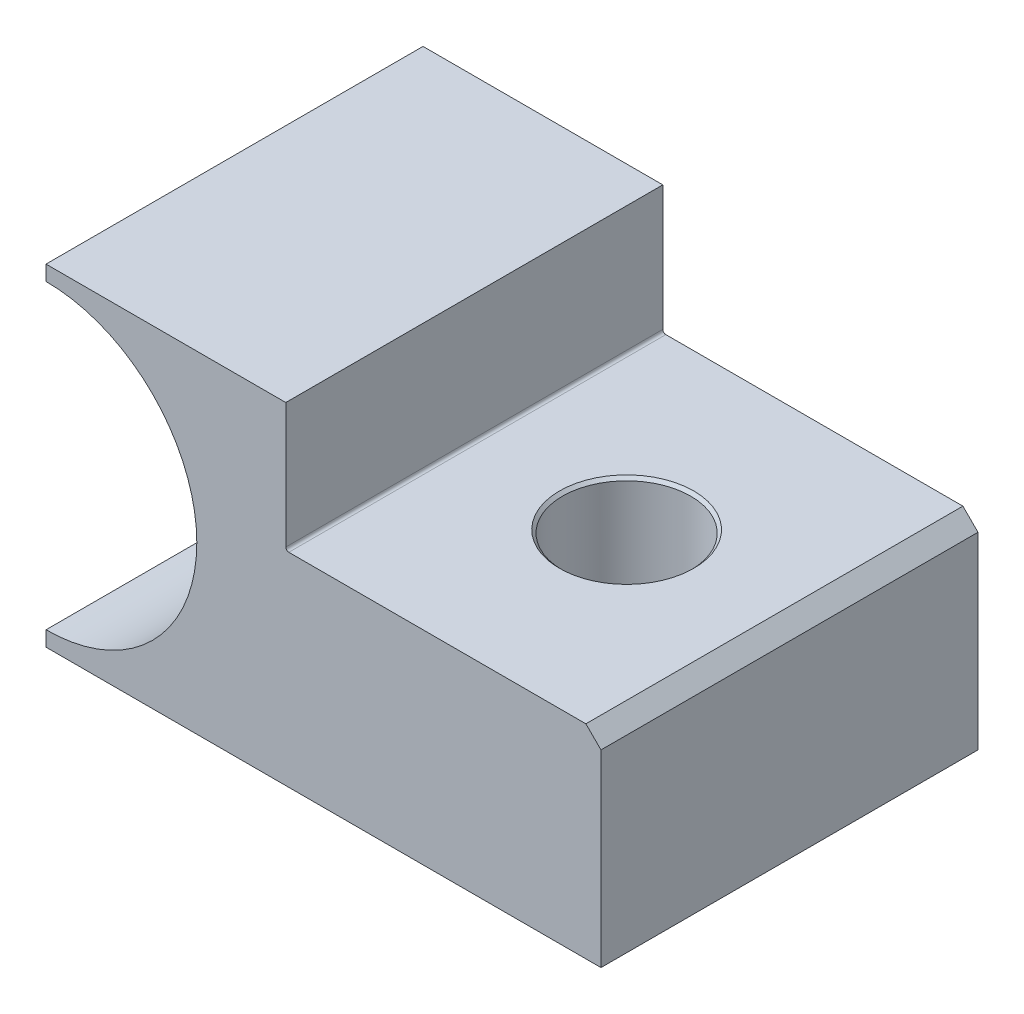
ISO-10303-21;
HEADER;
FILE_DESCRIPTION(('STEP AP214'),'2;1');
FILE_NAME('part.step','',(''),(''),'','','');
FILE_SCHEMA(('AUTOMOTIVE_DESIGN { 1 0 10303 214 1 1 1 1 }'));
ENDSEC;
DATA;
#1=APPLICATION_CONTEXT('core data for automotive mechanical design processes');
#2=APPLICATION_PROTOCOL_DEFINITION('international standard','automotive_design',2000,#1);
#3=PRODUCT_CONTEXT('',#1,'mechanical');
#4=PRODUCT('Part','Part','',(#3));
#5=PRODUCT_RELATED_PRODUCT_CATEGORY('part','',(#4));
#6=PRODUCT_DEFINITION_FORMATION('','',#4);
#7=PRODUCT_DEFINITION_CONTEXT('part definition',#1,'design');
#8=PRODUCT_DEFINITION('design','',#6,#7);
#9=PRODUCT_DEFINITION_SHAPE('','',#8);
#10=(LENGTH_UNIT() NAMED_UNIT(*) SI_UNIT(.MILLI.,.METRE.));
#11=(NAMED_UNIT(*) PLANE_ANGLE_UNIT() SI_UNIT($,.RADIAN.));
#12=(NAMED_UNIT(*) SI_UNIT($,.STERADIAN.) SOLID_ANGLE_UNIT());
#13=UNCERTAINTY_MEASURE_WITH_UNIT(LENGTH_MEASURE(1.E-05),#10,'distance_accuracy_value','');
#14=(GEOMETRIC_REPRESENTATION_CONTEXT(3) GLOBAL_UNCERTAINTY_ASSIGNED_CONTEXT((#13)) GLOBAL_UNIT_ASSIGNED_CONTEXT((#10,
#11,#12)) REPRESENTATION_CONTEXT('',''));
#15=CARTESIAN_POINT('',(0.,0.,0.));
#16=DIRECTION('',(0.,0.,1.));
#17=DIRECTION('',(1.,0.,0.));
#18=AXIS2_PLACEMENT_3D('',#15,#16,#17);
#19=CARTESIAN_POINT('',(0.,27.94,31.75));
#20=DIRECTION('',(0.,-1.,0.));
#21=DIRECTION('',(0.,0.,-1.));
#22=AXIS2_PLACEMENT_3D('',#19,#20,#21);
#23=PLANE('',#22);
#24=DIRECTION('',(-1.,0.,0.));
#25=VECTOR('',#24,1.);
#26=CARTESIAN_POINT('',(0.,27.94,0.));
#27=LINE('',#26,#25);
#28=CARTESIAN_POINT('',(20.193,27.94,0.));
#29=VERTEX_POINT('',#28);
#30=CARTESIAN_POINT('',(0.,27.94,0.));
#31=VERTEX_POINT('',#30);
#32=EDGE_CURVE('E149',#29,#31,#27,.T.);
#33=ORIENTED_EDGE('',*,*,#32,.T.);
#34=DIRECTION('',(0.,0.,-1.));
#35=VECTOR('',#34,1.);
#36=CARTESIAN_POINT('',(0.,27.94,31.75));
#37=LINE('',#36,#35);
#38=CARTESIAN_POINT('',(0.,27.94,31.75));
#39=VERTEX_POINT('',#38);
#40=EDGE_CURVE('E129',#39,#31,#37,.T.);
#41=ORIENTED_EDGE('',*,*,#40,.F.);
#42=DIRECTION('',(-1.,0.,0.));
#43=VECTOR('',#42,1.);
#44=CARTESIAN_POINT('',(0.,27.94,31.75));
#45=LINE('',#44,#43);
#46=CARTESIAN_POINT('',(20.193,27.94,31.75));
#47=VERTEX_POINT('',#46);
#48=EDGE_CURVE('E136',#47,#39,#45,.T.);
#49=ORIENTED_EDGE('',*,*,#48,.F.);
#50=DIRECTION('',(0.,0.,-1.));
#51=VECTOR('',#50,1.);
#52=CARTESIAN_POINT('',(20.193,27.94,31.75));
#53=LINE('',#52,#51);
#54=EDGE_CURVE('E185',#47,#29,#53,.T.);
#55=ORIENTED_EDGE('',*,*,#54,.T.);
#56=EDGE_LOOP('',(#33,#41,#49,#55));
#57=FACE_BOUND('',#56,.T.);
#58=ADVANCED_FACE('F48',(#57),#23,.F.);
#59=CARTESIAN_POINT('',(0.,26.67,31.75));
#60=DIRECTION('',(1.,0.,0.));
#61=DIRECTION('',(0.,0.,-1.));
#62=AXIS2_PLACEMENT_3D('',#59,#60,#61);
#63=PLANE('',#62);
#64=DIRECTION('',(0.,-1.,0.));
#65=VECTOR('',#64,1.);
#66=CARTESIAN_POINT('',(0.,26.67,0.));
#67=LINE('',#66,#65);
#68=CARTESIAN_POINT('',(0.,26.67,0.));
#69=VERTEX_POINT('',#68);
#70=EDGE_CURVE('E209',#31,#69,#67,.T.);
#71=ORIENTED_EDGE('',*,*,#70,.T.);
#72=DIRECTION('',(0.,0.,-1.));
#73=VECTOR('',#72,1.);
#74=CARTESIAN_POINT('',(0.,26.67,31.75));
#75=LINE('',#74,#73);
#76=CARTESIAN_POINT('',(0.,26.67,31.75));
#77=VERTEX_POINT('',#76);
#78=EDGE_CURVE('E132',#77,#69,#75,.T.);
#79=ORIENTED_EDGE('',*,*,#78,.F.);
#80=DIRECTION('',(0.,-1.,0.));
#81=VECTOR('',#80,1.);
#82=CARTESIAN_POINT('',(0.,26.67,31.75));
#83=LINE('',#82,#81);
#84=EDGE_CURVE('E125',#39,#77,#83,.T.);
#85=ORIENTED_EDGE('',*,*,#84,.F.);
#86=ORIENTED_EDGE('',*,*,#40,.T.);
#87=EDGE_LOOP('',(#71,#79,#85,#86));
#88=FACE_BOUND('',#87,.T.);
#89=ADVANCED_FACE('F127',(#88),#63,.F.);
#90=CARTESIAN_POINT('',(0.,13.97,31.75));
#91=DIRECTION('',(0.,0.,-1.));
#92=DIRECTION('',(-1.,0.,0.));
#93=AXIS2_PLACEMENT_3D('',#90,#91,#92);
#94=CYLINDRICAL_SURFACE('',#93,12.7);
#95=CARTESIAN_POINT('',(0.,13.97,0.));
#96=DIRECTION('',(0.,0.,-1.));
#97=DIRECTION('',(1.,0.,0.));
#98=AXIS2_PLACEMENT_3D('',#95,#96,#97);
#99=CIRCLE('',#98,12.7);
#100=CARTESIAN_POINT('',(0.,1.27,0.));
#101=VERTEX_POINT('',#100);
#102=EDGE_CURVE('E204',#69,#101,#99,.T.);
#103=ORIENTED_EDGE('',*,*,#102,.T.);
#104=DIRECTION('',(0.,0.,-1.));
#105=VECTOR('',#104,1.);
#106=CARTESIAN_POINT('',(0.,1.27,31.75));
#107=LINE('',#106,#105);
#108=CARTESIAN_POINT('',(0.,1.27,31.75));
#109=VERTEX_POINT('',#108);
#110=EDGE_CURVE('E155',#109,#101,#107,.T.);
#111=ORIENTED_EDGE('',*,*,#110,.F.);
#112=CARTESIAN_POINT('',(0.,13.97,31.75));
#113=DIRECTION('',(0.,0.,-1.));
#114=DIRECTION('',(1.,0.,0.));
#115=AXIS2_PLACEMENT_3D('',#112,#113,#114);
#116=CIRCLE('',#115,12.7);
#117=EDGE_CURVE('E135',#77,#109,#116,.T.);
#118=ORIENTED_EDGE('',*,*,#117,.F.);
#119=ORIENTED_EDGE('',*,*,#78,.T.);
#120=EDGE_LOOP('',(#103,#111,#118,#119));
#121=FACE_BOUND('',#120,.T.);
#122=ADVANCED_FACE('F232',(#121),#94,.F.);
#123=CARTESIAN_POINT('',(0.,1.27,31.75));
#124=DIRECTION('',(1.,0.,0.));
#125=DIRECTION('',(0.,1.,0.));
#126=AXIS2_PLACEMENT_3D('',#123,#124,#125);
#127=PLANE('',#126);
#128=DIRECTION('',(0.,-1.,0.));
#129=VECTOR('',#128,1.);
#130=CARTESIAN_POINT('',(0.,1.27,0.));
#131=LINE('',#130,#129);
#132=CARTESIAN_POINT('',(0.,0.,0.));
#133=VERTEX_POINT('',#132);
#134=EDGE_CURVE('E199',#101,#133,#131,.T.);
#135=ORIENTED_EDGE('',*,*,#134,.T.);
#136=DIRECTION('',(0.,0.,-1.));
#137=VECTOR('',#136,1.);
#138=CARTESIAN_POINT('',(0.,0.,31.75));
#139=LINE('',#138,#137);
#140=CARTESIAN_POINT('',(0.,0.,31.75));
#141=VERTEX_POINT('',#140);
#142=EDGE_CURVE('E190',#141,#133,#139,.T.);
#143=ORIENTED_EDGE('',*,*,#142,.F.);
#144=DIRECTION('',(0.,-1.,0.));
#145=VECTOR('',#144,1.);
#146=CARTESIAN_POINT('',(0.,1.27,31.75));
#147=LINE('',#146,#145);
#148=EDGE_CURVE('E200',#109,#141,#147,.T.);
#149=ORIENTED_EDGE('',*,*,#148,.F.);
#150=ORIENTED_EDGE('',*,*,#110,.T.);
#151=EDGE_LOOP('',(#135,#143,#149,#150));
#152=FACE_BOUND('',#151,.T.);
#153=ADVANCED_FACE('F197',(#152),#127,.F.);
#154=CARTESIAN_POINT('',(0.,0.,31.75));
#155=DIRECTION('',(0.,1.,0.));
#156=DIRECTION('',(0.,0.,1.));
#157=AXIS2_PLACEMENT_3D('',#154,#155,#156);
#158=PLANE('',#157);
#159=CARTESIAN_POINT('',(33.02,0.,15.875));
#160=DIRECTION('',(0.,1.,0.));
#161=DIRECTION('',(0.,0.,1.));
#162=AXIS2_PLACEMENT_3D('',#159,#160,#161);
#163=CIRCLE('',#162,5.3975);
#164=CARTESIAN_POINT('',(33.02,0.,21.2725));
#165=VERTEX_POINT('',#164);
#166=EDGE_CURVE('E231',#165,#165,#163,.T.);
#167=ORIENTED_EDGE('',*,*,#166,.T.);
#168=EDGE_LOOP('',(#167));
#169=FACE_BOUND('',#168,.T.);
#170=DIRECTION('',(1.,0.,0.));
#171=VECTOR('',#170,1.);
#172=CARTESIAN_POINT('',(0.,0.,0.));
#173=LINE('',#172,#171);
#174=CARTESIAN_POINT('',(46.736,0.,0.));
#175=VERTEX_POINT('',#174);
#176=EDGE_CURVE('E206',#133,#175,#173,.T.);
#177=ORIENTED_EDGE('',*,*,#176,.T.);
#178=DIRECTION('',(0.,0.,-1.));
#179=VECTOR('',#178,1.);
#180=CARTESIAN_POINT('',(46.736,0.,31.75));
#181=LINE('',#180,#179);
#182=CARTESIAN_POINT('',(46.736,0.,31.75));
#183=VERTEX_POINT('',#182);
#184=EDGE_CURVE('E187',#183,#175,#181,.T.);
#185=ORIENTED_EDGE('',*,*,#184,.F.);
#186=DIRECTION('',(1.,0.,0.));
#187=VECTOR('',#186,1.);
#188=CARTESIAN_POINT('',(0.,0.,31.75));
#189=LINE('',#188,#187);
#190=EDGE_CURVE('E227',#141,#183,#189,.T.);
#191=ORIENTED_EDGE('',*,*,#190,.F.);
#192=ORIENTED_EDGE('',*,*,#142,.T.);
#193=EDGE_LOOP('',(#177,#185,#191,#192));
#194=FACE_BOUND('',#193,.T.);
#195=ADVANCED_FACE('F237',(#169,#194),#158,.F.);
#196=CARTESIAN_POINT('',(46.736,0.,31.75));
#197=DIRECTION('',(-1.,0.,0.));
#198=DIRECTION('',(0.,0.,1.));
#199=AXIS2_PLACEMENT_3D('',#196,#197,#198);
#200=PLANE('',#199);
#201=DIRECTION('',(0.,1.,0.));
#202=VECTOR('',#201,1.);
#203=CARTESIAN_POINT('',(46.736,0.,0.));
#204=LINE('',#203,#202);
#205=CARTESIAN_POINT('',(46.736,15.875,0.));
#206=VERTEX_POINT('',#205);
#207=EDGE_CURVE('E181',#175,#206,#204,.T.);
#208=ORIENTED_EDGE('',*,*,#207,.T.);
#209=DIRECTION('',(0.,0.,1.));
#210=VECTOR('',#209,1.);
#211=CARTESIAN_POINT('',(46.736,15.875,31.75));
#212=LINE('',#211,#210);
#213=CARTESIAN_POINT('',(46.736,15.875,31.75));
#214=VERTEX_POINT('',#213);
#215=EDGE_CURVE('E160',#206,#214,#212,.T.);
#216=ORIENTED_EDGE('',*,*,#215,.T.);
#217=DIRECTION('',(0.,1.,0.));
#218=VECTOR('',#217,1.);
#219=CARTESIAN_POINT('',(46.736,0.,31.75));
#220=LINE('',#219,#218);
#221=EDGE_CURVE('E223',#183,#214,#220,.T.);
#222=ORIENTED_EDGE('',*,*,#221,.F.);
#223=ORIENTED_EDGE('',*,*,#184,.T.);
#224=EDGE_LOOP('',(#208,#216,#222,#223));
#225=FACE_BOUND('',#224,.T.);
#226=ADVANCED_FACE('F215',(#225),#200,.F.);
#227=CARTESIAN_POINT('',(20.193,17.145,31.75));
#228=DIRECTION('',(0.,-1.,0.));
#229=DIRECTION('',(0.,0.,-1.));
#230=AXIS2_PLACEMENT_3D('',#227,#228,#229);
#231=PLANE('',#230);
#232=CARTESIAN_POINT('',(33.02,17.145,15.875));
#233=DIRECTION('',(0.,-1.,0.));
#234=DIRECTION('',(0.,0.,-1.));
#235=AXIS2_PLACEMENT_3D('',#232,#233,#234);
#236=CIRCLE('',#235,5.65150000000001);
#237=CARTESIAN_POINT('',(33.02,17.145,10.2235));
#238=VERTEX_POINT('',#237);
#239=EDGE_CURVE('E167',#238,#238,#236,.T.);
#240=ORIENTED_EDGE('',*,*,#239,.T.);
#241=EDGE_LOOP('',(#240));
#242=FACE_BOUND('',#241,.T.);
#243=DIRECTION('',(-1.,0.,0.));
#244=VECTOR('',#243,1.);
#245=CARTESIAN_POINT('',(20.193,17.145,0.));
#246=LINE('',#245,#244);
#247=CARTESIAN_POINT('',(45.466,17.145,0.));
#248=VERTEX_POINT('',#247);
#249=CARTESIAN_POINT('',(20.447,17.145,0.));
#250=VERTEX_POINT('',#249);
#251=EDGE_CURVE('E179',#248,#250,#246,.T.);
#252=ORIENTED_EDGE('',*,*,#251,.T.);
#253=DIRECTION('',(0.,0.,-1.));
#254=VECTOR('',#253,1.);
#255=CARTESIAN_POINT('',(20.447,17.145,31.75));
#256=LINE('',#255,#254);
#257=CARTESIAN_POINT('',(20.447,17.145,31.75));
#258=VERTEX_POINT('',#257);
#259=EDGE_CURVE('E69',#250,#258,#256,.F.);
#260=ORIENTED_EDGE('',*,*,#259,.T.);
#261=DIRECTION('',(-1.,0.,0.));
#262=VECTOR('',#261,1.);
#263=CARTESIAN_POINT('',(20.193,17.145,31.75));
#264=LINE('',#263,#262);
#265=CARTESIAN_POINT('',(45.466,17.145,31.75));
#266=VERTEX_POINT('',#265);
#267=EDGE_CURVE('E222',#266,#258,#264,.T.);
#268=ORIENTED_EDGE('',*,*,#267,.F.);
#269=DIRECTION('',(0.,0.,-1.));
#270=VECTOR('',#269,1.);
#271=CARTESIAN_POINT('',(45.466,17.145,31.75));
#272=LINE('',#271,#270);
#273=EDGE_CURVE('E150',#266,#248,#272,.T.);
#274=ORIENTED_EDGE('',*,*,#273,.T.);
#275=EDGE_LOOP('',(#252,#260,#268,#274));
#276=FACE_BOUND('',#275,.T.);
#277=ADVANCED_FACE('F224',(#242,#276),#231,.F.);
#278=CARTESIAN_POINT('',(20.193,27.94,31.75));
#279=DIRECTION('',(-1.,0.,0.));
#280=DIRECTION('',(0.,0.,1.));
#281=AXIS2_PLACEMENT_3D('',#278,#279,#280);
#282=PLANE('',#281);
#283=DIRECTION('',(0.,1.,0.));
#284=VECTOR('',#283,1.);
#285=CARTESIAN_POINT('',(20.193,27.94,31.75));
#286=LINE('',#285,#284);
#287=CARTESIAN_POINT('',(20.193,17.399,31.75));
#288=VERTEX_POINT('',#287);
#289=EDGE_CURVE('E142',#288,#47,#286,.T.);
#290=ORIENTED_EDGE('',*,*,#289,.F.);
#291=DIRECTION('',(0.,0.,-1.));
#292=VECTOR('',#291,1.);
#293=CARTESIAN_POINT('',(20.193,17.399,0.));
#294=LINE('',#293,#292);
#295=CARTESIAN_POINT('',(20.193,17.399,0.));
#296=VERTEX_POINT('',#295);
#297=EDGE_CURVE('E170',#288,#296,#294,.T.);
#298=ORIENTED_EDGE('',*,*,#297,.T.);
#299=DIRECTION('',(0.,1.,0.));
#300=VECTOR('',#299,1.);
#301=CARTESIAN_POINT('',(20.193,27.94,0.));
#302=LINE('',#301,#300);
#303=EDGE_CURVE('E146',#296,#29,#302,.T.);
#304=ORIENTED_EDGE('',*,*,#303,.T.);
#305=ORIENTED_EDGE('',*,*,#54,.F.);
#306=EDGE_LOOP('',(#290,#298,#304,#305));
#307=FACE_BOUND('',#306,.T.);
#308=ADVANCED_FACE('F175',(#307),#282,.F.);
#309=CARTESIAN_POINT('',(0.,13.97,31.75));
#310=DIRECTION('',(0.,0.,1.));
#311=DIRECTION('',(1.,0.,0.));
#312=AXIS2_PLACEMENT_3D('',#309,#310,#311);
#313=PLANE('',#312);
#314=ORIENTED_EDGE('',*,*,#221,.T.);
#315=DIRECTION('',(0.707106781186546,-0.70710678118655,0.));
#316=VECTOR('',#315,1.);
#317=CARTESIAN_POINT('',(24.3205000000001,38.2905,31.75));
#318=LINE('',#317,#316);
#319=EDGE_CURVE('E162',#214,#266,#318,.F.);
#320=ORIENTED_EDGE('',*,*,#319,.T.);
#321=ORIENTED_EDGE('',*,*,#267,.T.);
#322=CARTESIAN_POINT('',(20.447,17.399,31.75));
#323=DIRECTION('',(0.,0.,1.));
#324=DIRECTION('',(1.,0.,0.));
#325=AXIS2_PLACEMENT_3D('',#322,#323,#324);
#326=CIRCLE('',#325,0.254);
#327=EDGE_CURVE('E11',#258,#288,#326,.F.);
#328=ORIENTED_EDGE('',*,*,#327,.T.);
#329=ORIENTED_EDGE('',*,*,#289,.T.);
#330=ORIENTED_EDGE('',*,*,#48,.T.);
#331=ORIENTED_EDGE('',*,*,#84,.T.);
#332=ORIENTED_EDGE('',*,*,#117,.T.);
#333=ORIENTED_EDGE('',*,*,#148,.T.);
#334=ORIENTED_EDGE('',*,*,#190,.T.);
#335=EDGE_LOOP('',(#314,#320,#321,#328,#329,#330,#331,#332,#333,#334));
#336=FACE_BOUND('',#335,.T.);
#337=ADVANCED_FACE('F140',(#336),#313,.T.);
#338=CARTESIAN_POINT('',(0.,13.97,0.));
#339=DIRECTION('',(0.,0.,1.));
#340=DIRECTION('',(1.,0.,0.));
#341=AXIS2_PLACEMENT_3D('',#338,#339,#340);
#342=PLANE('',#341);
#343=ORIENTED_EDGE('',*,*,#251,.F.);
#344=DIRECTION('',(-0.707106781186546,0.70710678118655,0.));
#345=VECTOR('',#344,1.);
#346=CARTESIAN_POINT('',(45.466,17.145,0.));
#347=LINE('',#346,#345);
#348=EDGE_CURVE('E153',#248,#206,#347,.F.);
#349=ORIENTED_EDGE('',*,*,#348,.T.);
#350=ORIENTED_EDGE('',*,*,#207,.F.);
#351=ORIENTED_EDGE('',*,*,#176,.F.);
#352=ORIENTED_EDGE('',*,*,#134,.F.);
#353=ORIENTED_EDGE('',*,*,#102,.F.);
#354=ORIENTED_EDGE('',*,*,#70,.F.);
#355=ORIENTED_EDGE('',*,*,#32,.F.);
#356=ORIENTED_EDGE('',*,*,#303,.F.);
#357=CARTESIAN_POINT('',(20.447,17.399,0.));
#358=DIRECTION('',(0.,0.,1.));
#359=DIRECTION('',(1.,0.,0.));
#360=AXIS2_PLACEMENT_3D('',#357,#358,#359);
#361=CIRCLE('',#360,0.254);
#362=EDGE_CURVE('E56',#296,#250,#361,.T.);
#363=ORIENTED_EDGE('',*,*,#362,.T.);
#364=EDGE_LOOP('',(#343,#349,#350,#351,#352,#353,#354,#355,#356,#363));
#365=FACE_BOUND('',#364,.T.);
#366=ADVANCED_FACE('F178',(#365),#342,.F.);
#367=CARTESIAN_POINT('',(33.02,17.145,15.875));
#368=DIRECTION('',(0.,1.,0.));
#369=DIRECTION('',(0.,0.,1.));
#370=AXIS2_PLACEMENT_3D('',#367,#368,#369);
#371=CYLINDRICAL_SURFACE('',#370,5.3975);
#372=CARTESIAN_POINT('',(33.02,16.891,15.875));
#373=DIRECTION('',(0.,-1.,0.));
#374=DIRECTION('',(0.,0.,-1.));
#375=AXIS2_PLACEMENT_3D('',#372,#373,#374);
#376=CIRCLE('',#375,5.3975);
#377=CARTESIAN_POINT('',(33.02,16.891,10.4775));
#378=VERTEX_POINT('',#377);
#379=EDGE_CURVE('E164',#378,#378,#376,.F.);
#380=ORIENTED_EDGE('',*,*,#379,.T.);
#381=EDGE_LOOP('',(#380));
#382=FACE_BOUND('',#381,.T.);
#383=ORIENTED_EDGE('',*,*,#166,.F.);
#384=EDGE_LOOP('',(#383));
#385=FACE_BOUND('',#384,.T.);
#386=ADVANCED_FACE('F262',(#382,#385),#371,.F.);
#387=CARTESIAN_POINT('',(45.466,17.145,31.75));
#388=DIRECTION('',(-0.70710678118655,-0.707106781186546,0.));
#389=DIRECTION('',(0.,0.,-1.));
#390=AXIS2_PLACEMENT_3D('',#387,#388,#389);
#391=PLANE('',#390);
#392=ORIENTED_EDGE('',*,*,#319,.F.);
#393=ORIENTED_EDGE('',*,*,#215,.F.);
#394=ORIENTED_EDGE('',*,*,#348,.F.);
#395=ORIENTED_EDGE('',*,*,#273,.F.);
#396=EDGE_LOOP('',(#392,#393,#394,#395));
#397=FACE_BOUND('',#396,.T.);
#398=ADVANCED_FACE('F220',(#397),#391,.F.);
#399=CARTESIAN_POINT('',(33.02,16.891,15.875));
#400=DIRECTION('',(0.,1.,0.));
#401=DIRECTION('',(0.,0.,1.));
#402=AXIS2_PLACEMENT_3D('',#399,#400,#401);
#403=CONICAL_SURFACE('',#402,5.3975,0.785398163397455);
#404=ORIENTED_EDGE('',*,*,#239,.F.);
#405=EDGE_LOOP('',(#404));
#406=FACE_BOUND('',#405,.T.);
#407=ORIENTED_EDGE('',*,*,#379,.F.);
#408=EDGE_LOOP('',(#407));
#409=FACE_BOUND('',#408,.T.);
#410=ADVANCED_FACE('F261',(#406,#409),#403,.F.);
#411=CARTESIAN_POINT('',(20.447,17.399,31.75));
#412=DIRECTION('',(0.,0.,1.));
#413=DIRECTION('',(1.,0.,0.));
#414=AXIS2_PLACEMENT_3D('',#411,#412,#413);
#415=CYLINDRICAL_SURFACE('',#414,0.254);
#416=ORIENTED_EDGE('',*,*,#327,.F.);
#417=ORIENTED_EDGE('',*,*,#259,.F.);
#418=ORIENTED_EDGE('',*,*,#362,.F.);
#419=ORIENTED_EDGE('',*,*,#297,.F.);
#420=EDGE_LOOP('',(#416,#417,#418,#419));
#421=FACE_BOUND('',#420,.T.);
#422=ADVANCED_FACE('F50',(#421),#415,.F.);
#423=CLOSED_SHELL('',(#58,#89,#122,#153,#195,#226,#277,#308,#337,#366,#386,#398,#410,#422));
#424=MANIFOLD_SOLID_BREP('B2',#423);
#425=ADVANCED_BREP_SHAPE_REPRESENTATION('',(#18,#424),#14);
#426=SHAPE_DEFINITION_REPRESENTATION(#9,#425);
ENDSEC;
END-ISO-10303-21;
